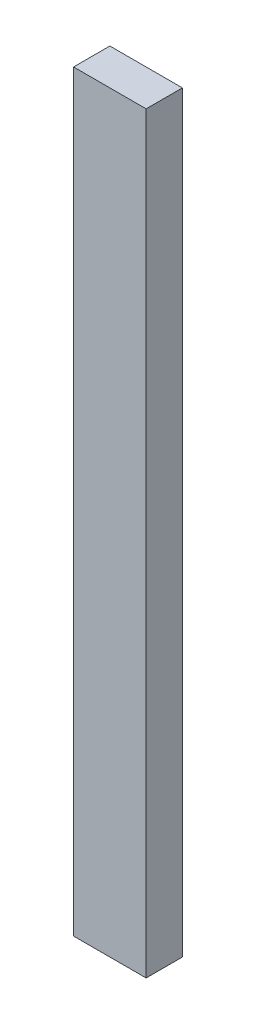
ISO-10303-21;
HEADER;
FILE_DESCRIPTION(('STEP AP214'),'2;1');
FILE_NAME('part.step','',(''),(''),'','','');
FILE_SCHEMA(('AUTOMOTIVE_DESIGN { 1 0 10303 214 1 1 1 1 }'));
ENDSEC;
DATA;
#1=APPLICATION_CONTEXT('core data for automotive mechanical design processes');
#2=APPLICATION_PROTOCOL_DEFINITION('international standard','automotive_design',2000,#1);
#3=PRODUCT_CONTEXT('',#1,'mechanical');
#4=PRODUCT('Part','Part','',(#3));
#5=PRODUCT_RELATED_PRODUCT_CATEGORY('part','',(#4));
#6=PRODUCT_DEFINITION_FORMATION('','',#4);
#7=PRODUCT_DEFINITION_CONTEXT('part definition',#1,'design');
#8=PRODUCT_DEFINITION('design','',#6,#7);
#9=PRODUCT_DEFINITION_SHAPE('','',#8);
#10=(LENGTH_UNIT() NAMED_UNIT(*) SI_UNIT(.MILLI.,.METRE.));
#11=(NAMED_UNIT(*) PLANE_ANGLE_UNIT() SI_UNIT($,.RADIAN.));
#12=(NAMED_UNIT(*) SI_UNIT($,.STERADIAN.) SOLID_ANGLE_UNIT());
#13=UNCERTAINTY_MEASURE_WITH_UNIT(LENGTH_MEASURE(1.E-05),#10,'distance_accuracy_value','');
#14=(GEOMETRIC_REPRESENTATION_CONTEXT(3) GLOBAL_UNCERTAINTY_ASSIGNED_CONTEXT((#13)) GLOBAL_UNIT_ASSIGNED_CONTEXT((#10,
#11,#12)) REPRESENTATION_CONTEXT('',''));
#15=CARTESIAN_POINT('',(0.,0.,0.));
#16=DIRECTION('',(0.,0.,1.));
#17=DIRECTION('',(1.,0.,0.));
#18=AXIS2_PLACEMENT_3D('',#15,#16,#17);
#19=CARTESIAN_POINT('',(0.,263.525,0.));
#20=DIRECTION('',(1.,0.,0.));
#21=DIRECTION('',(0.,0.,-1.));
#22=AXIS2_PLACEMENT_3D('',#19,#20,#21);
#23=PLANE('',#22);
#24=DIRECTION('',(0.,0.,1.));
#25=VECTOR('',#24,1.);
#26=CARTESIAN_POINT('',(0.,0.,0.));
#27=LINE('',#26,#25);
#28=CARTESIAN_POINT('',(0.,0.,-12.7));
#29=VERTEX_POINT('',#28);
#30=CARTESIAN_POINT('',(0.,0.,0.));
#31=VERTEX_POINT('',#30);
#32=EDGE_CURVE('E97',#29,#31,#27,.T.);
#33=ORIENTED_EDGE('',*,*,#32,.T.);
#34=DIRECTION('',(0.,-1.,0.));
#35=VECTOR('',#34,1.);
#36=CARTESIAN_POINT('',(0.,263.525,0.));
#37=LINE('',#36,#35);
#38=CARTESIAN_POINT('',(0.,263.525,0.));
#39=VERTEX_POINT('',#38);
#40=EDGE_CURVE('E11',#39,#31,#37,.T.);
#41=ORIENTED_EDGE('',*,*,#40,.F.);
#42=DIRECTION('',(0.,0.,1.));
#43=VECTOR('',#42,1.);
#44=CARTESIAN_POINT('',(0.,263.525,0.));
#45=LINE('',#44,#43);
#46=CARTESIAN_POINT('',(0.,263.525,-12.7));
#47=VERTEX_POINT('',#46);
#48=EDGE_CURVE('E85',#47,#39,#45,.T.);
#49=ORIENTED_EDGE('',*,*,#48,.F.);
#50=DIRECTION('',(0.,-1.,0.));
#51=VECTOR('',#50,1.);
#52=CARTESIAN_POINT('',(0.,263.525,-12.7));
#53=LINE('',#52,#51);
#54=EDGE_CURVE('E93',#47,#29,#53,.T.);
#55=ORIENTED_EDGE('',*,*,#54,.T.);
#56=EDGE_LOOP('',(#33,#41,#49,#55));
#57=FACE_BOUND('',#56,.T.);
#58=ADVANCED_FACE('F34',(#57),#23,.F.);
#59=CARTESIAN_POINT('',(0.,263.525,0.));
#60=DIRECTION('',(0.,0.,-1.));
#61=DIRECTION('',(-1.,0.,0.));
#62=AXIS2_PLACEMENT_3D('',#59,#60,#61);
#63=PLANE('',#62);
#64=DIRECTION('',(1.,0.,0.));
#65=VECTOR('',#64,1.);
#66=CARTESIAN_POINT('',(0.,0.,0.));
#67=LINE('',#66,#65);
#68=CARTESIAN_POINT('',(25.4,0.,0.));
#69=VERTEX_POINT('',#68);
#70=EDGE_CURVE('E89',#31,#69,#67,.T.);
#71=ORIENTED_EDGE('',*,*,#70,.T.);
#72=DIRECTION('',(0.,-1.,0.));
#73=VECTOR('',#72,1.);
#74=CARTESIAN_POINT('',(25.4,263.525,0.));
#75=LINE('',#74,#73);
#76=CARTESIAN_POINT('',(25.4,263.525,0.));
#77=VERTEX_POINT('',#76);
#78=EDGE_CURVE('E42',#77,#69,#75,.T.);
#79=ORIENTED_EDGE('',*,*,#78,.F.);
#80=DIRECTION('',(1.,0.,0.));
#81=VECTOR('',#80,1.);
#82=CARTESIAN_POINT('',(0.,263.525,0.));
#83=LINE('',#82,#81);
#84=EDGE_CURVE('E80',#39,#77,#83,.T.);
#85=ORIENTED_EDGE('',*,*,#84,.F.);
#86=ORIENTED_EDGE('',*,*,#40,.T.);
#87=EDGE_LOOP('',(#71,#79,#85,#86));
#88=FACE_BOUND('',#87,.T.);
#89=ADVANCED_FACE('F88',(#88),#63,.F.);
#90=CARTESIAN_POINT('',(25.4,263.525,0.));
#91=DIRECTION('',(-1.,0.,0.));
#92=DIRECTION('',(0.,0.,1.));
#93=AXIS2_PLACEMENT_3D('',#90,#91,#92);
#94=PLANE('',#93);
#95=DIRECTION('',(0.,0.,-1.));
#96=VECTOR('',#95,1.);
#97=CARTESIAN_POINT('',(25.4,0.,0.));
#98=LINE('',#97,#96);
#99=CARTESIAN_POINT('',(25.4,0.,-12.7));
#100=VERTEX_POINT('',#99);
#101=EDGE_CURVE('E67',#69,#100,#98,.T.);
#102=ORIENTED_EDGE('',*,*,#101,.T.);
#103=DIRECTION('',(0.,-1.,0.));
#104=VECTOR('',#103,1.);
#105=CARTESIAN_POINT('',(25.4,263.525,-12.7));
#106=LINE('',#105,#104);
#107=CARTESIAN_POINT('',(25.4,263.525,-12.7));
#108=VERTEX_POINT('',#107);
#109=EDGE_CURVE('E90',#108,#100,#106,.T.);
#110=ORIENTED_EDGE('',*,*,#109,.F.);
#111=DIRECTION('',(0.,0.,-1.));
#112=VECTOR('',#111,1.);
#113=CARTESIAN_POINT('',(25.4,263.525,0.));
#114=LINE('',#113,#112);
#115=EDGE_CURVE('E83',#77,#108,#114,.T.);
#116=ORIENTED_EDGE('',*,*,#115,.F.);
#117=ORIENTED_EDGE('',*,*,#78,.T.);
#118=EDGE_LOOP('',(#102,#110,#116,#117));
#119=FACE_BOUND('',#118,.T.);
#120=ADVANCED_FACE('F91',(#119),#94,.F.);
#121=CARTESIAN_POINT('',(0.,263.525,-12.7));
#122=DIRECTION('',(0.,0.,1.));
#123=DIRECTION('',(1.,0.,0.));
#124=AXIS2_PLACEMENT_3D('',#121,#122,#123);
#125=PLANE('',#124);
#126=DIRECTION('',(-1.,0.,0.));
#127=VECTOR('',#126,1.);
#128=CARTESIAN_POINT('',(0.,0.,-12.7));
#129=LINE('',#128,#127);
#130=EDGE_CURVE('E73',#100,#29,#129,.T.);
#131=ORIENTED_EDGE('',*,*,#130,.T.);
#132=ORIENTED_EDGE('',*,*,#54,.F.);
#133=DIRECTION('',(-1.,0.,0.));
#134=VECTOR('',#133,1.);
#135=CARTESIAN_POINT('',(0.,263.525,-12.7));
#136=LINE('',#135,#134);
#137=EDGE_CURVE('E50',#108,#47,#136,.T.);
#138=ORIENTED_EDGE('',*,*,#137,.F.);
#139=ORIENTED_EDGE('',*,*,#109,.T.);
#140=EDGE_LOOP('',(#131,#132,#138,#139));
#141=FACE_BOUND('',#140,.T.);
#142=ADVANCED_FACE('F104',(#141),#125,.F.);
#143=CARTESIAN_POINT('',(0.,263.525,0.));
#144=DIRECTION('',(0.,-1.,0.));
#145=DIRECTION('',(0.,0.,-1.));
#146=AXIS2_PLACEMENT_3D('',#143,#144,#145);
#147=PLANE('',#146);
#148=ORIENTED_EDGE('',*,*,#48,.T.);
#149=ORIENTED_EDGE('',*,*,#84,.T.);
#150=ORIENTED_EDGE('',*,*,#115,.T.);
#151=ORIENTED_EDGE('',*,*,#137,.T.);
#152=EDGE_LOOP('',(#148,#149,#150,#151));
#153=FACE_BOUND('',#152,.T.);
#154=ADVANCED_FACE('F81',(#153),#147,.F.);
#155=CARTESIAN_POINT('',(0.,0.,0.));
#156=DIRECTION('',(0.,-1.,0.));
#157=DIRECTION('',(0.,0.,-1.));
#158=AXIS2_PLACEMENT_3D('',#155,#156,#157);
#159=PLANE('',#158);
#160=ORIENTED_EDGE('',*,*,#32,.F.);
#161=ORIENTED_EDGE('',*,*,#130,.F.);
#162=ORIENTED_EDGE('',*,*,#101,.F.);
#163=ORIENTED_EDGE('',*,*,#70,.F.);
#164=EDGE_LOOP('',(#160,#161,#162,#163));
#165=FACE_BOUND('',#164,.T.);
#166=ADVANCED_FACE('F107',(#165),#159,.T.);
#167=CLOSED_SHELL('',(#58,#89,#120,#142,#154,#166));
#168=MANIFOLD_SOLID_BREP('B2',#167);
#169=ADVANCED_BREP_SHAPE_REPRESENTATION('',(#18,#168),#14);
#170=SHAPE_DEFINITION_REPRESENTATION(#9,#169);
ENDSEC;
END-ISO-10303-21;
